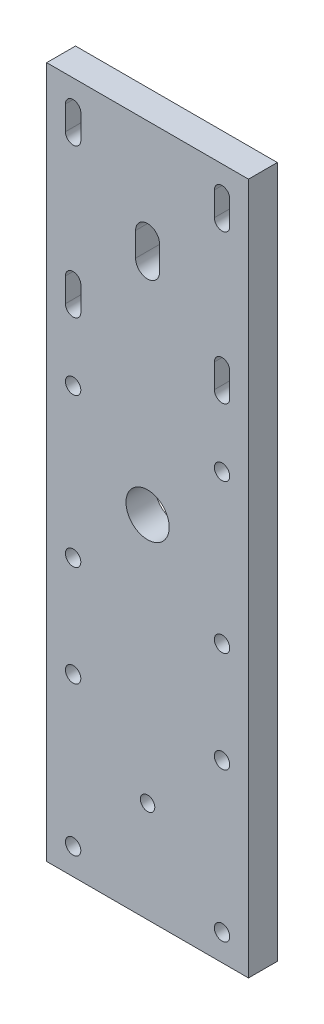
ISO-10303-21;
HEADER;
FILE_DESCRIPTION(('STEP AP214'),'2;1');
FILE_NAME('part.step','',(''),(''),'','','');
FILE_SCHEMA(('AUTOMOTIVE_DESIGN { 1 0 10303 214 1 1 1 1 }'));
ENDSEC;
DATA;
#1=APPLICATION_CONTEXT('core data for automotive mechanical design processes');
#2=APPLICATION_PROTOCOL_DEFINITION('international standard','automotive_design',2000,#1);
#3=PRODUCT_CONTEXT('',#1,'mechanical');
#4=PRODUCT('Part','Part','',(#3));
#5=PRODUCT_RELATED_PRODUCT_CATEGORY('part','',(#4));
#6=PRODUCT_DEFINITION_FORMATION('','',#4);
#7=PRODUCT_DEFINITION_CONTEXT('part definition',#1,'design');
#8=PRODUCT_DEFINITION('design','',#6,#7);
#9=PRODUCT_DEFINITION_SHAPE('','',#8);
#10=(LENGTH_UNIT() NAMED_UNIT(*) SI_UNIT(.MILLI.,.METRE.));
#11=(NAMED_UNIT(*) PLANE_ANGLE_UNIT() SI_UNIT($,.RADIAN.));
#12=(NAMED_UNIT(*) SI_UNIT($,.STERADIAN.) SOLID_ANGLE_UNIT());
#13=UNCERTAINTY_MEASURE_WITH_UNIT(LENGTH_MEASURE(1.E-05),#10,'distance_accuracy_value','');
#14=(GEOMETRIC_REPRESENTATION_CONTEXT(3) GLOBAL_UNCERTAINTY_ASSIGNED_CONTEXT((#13)) GLOBAL_UNIT_ASSIGNED_CONTEXT((#10,
#11,#12)) REPRESENTATION_CONTEXT('',''));
#15=CARTESIAN_POINT('',(0.,0.,0.));
#16=DIRECTION('',(0.,0.,1.));
#17=DIRECTION('',(1.,0.,0.));
#18=AXIS2_PLACEMENT_3D('',#15,#16,#17);
#19=CARTESIAN_POINT('',(15.5,86.4999999999999,6.));
#20=DIRECTION('',(0.,0.,-1.));
#21=DIRECTION('',(-1.,0.,0.));
#22=AXIS2_PLACEMENT_3D('',#19,#20,#21);
#23=CYLINDRICAL_SURFACE('',#22,1.6);
#24=CARTESIAN_POINT('',(15.5,86.4999999999999,0.));
#25=DIRECTION('',(0.,0.,1.));
#26=DIRECTION('',(1.,0.,0.));
#27=AXIS2_PLACEMENT_3D('',#24,#25,#26);
#28=CIRCLE('',#27,1.6);
#29=CARTESIAN_POINT('',(17.1000000000001,86.4999999999999,0.));
#30=VERTEX_POINT('',#29);
#31=CARTESIAN_POINT('',(13.9000000000001,86.4999999999999,0.));
#32=VERTEX_POINT('',#31);
#33=EDGE_CURVE('E323',#30,#32,#28,.T.);
#34=ORIENTED_EDGE('',*,*,#33,.F.);
#35=DIRECTION('',(0.,0.,-1.));
#36=VECTOR('',#35,1.);
#37=CARTESIAN_POINT('',(17.1000000000001,86.4999999999999,6.));
#38=LINE('',#37,#36);
#39=CARTESIAN_POINT('',(17.1000000000001,86.4999999999999,6.));
#40=VERTEX_POINT('',#39);
#41=EDGE_CURVE('E11',#40,#30,#38,.T.);
#42=ORIENTED_EDGE('',*,*,#41,.F.);
#43=CARTESIAN_POINT('',(15.5,86.4999999999999,6.));
#44=DIRECTION('',(0.,0.,1.));
#45=DIRECTION('',(1.,0.,0.));
#46=AXIS2_PLACEMENT_3D('',#43,#44,#45);
#47=CIRCLE('',#46,1.6);
#48=CARTESIAN_POINT('',(13.9000000000001,86.4999999999999,6.));
#49=VERTEX_POINT('',#48);
#50=EDGE_CURVE('E217',#40,#49,#47,.T.);
#51=ORIENTED_EDGE('',*,*,#50,.T.);
#52=DIRECTION('',(0.,0.,-1.));
#53=VECTOR('',#52,1.);
#54=CARTESIAN_POINT('',(13.9000000000001,86.4999999999999,6.));
#55=LINE('',#54,#53);
#56=EDGE_CURVE('E59',#49,#32,#55,.T.);
#57=ORIENTED_EDGE('',*,*,#56,.T.);
#58=EDGE_LOOP('',(#34,#42,#51,#57));
#59=FACE_BOUND('',#58,.T.);
#60=ADVANCED_FACE('F40',(#59),#23,.F.);
#61=CARTESIAN_POINT('',(17.1000000000001,0.,6.));
#62=DIRECTION('',(1.,0.,0.));
#63=DIRECTION('',(0.,0.,-1.));
#64=AXIS2_PLACEMENT_3D('',#61,#62,#63);
#65=PLANE('',#64);
#66=DIRECTION('',(0.,-1.,0.));
#67=VECTOR('',#66,1.);
#68=CARTESIAN_POINT('',(17.1000000000001,0.,0.));
#69=LINE('',#68,#67);
#70=CARTESIAN_POINT('',(17.1000000000001,81.5,0.));
#71=VERTEX_POINT('',#70);
#72=EDGE_CURVE('E223',#30,#71,#69,.T.);
#73=ORIENTED_EDGE('',*,*,#72,.T.);
#74=DIRECTION('',(0.,0.,-1.));
#75=VECTOR('',#74,1.);
#76=CARTESIAN_POINT('',(17.1000000000001,81.5,6.));
#77=LINE('',#76,#75);
#78=CARTESIAN_POINT('',(17.1000000000001,81.5,6.));
#79=VERTEX_POINT('',#78);
#80=EDGE_CURVE('E50',#79,#71,#77,.T.);
#81=ORIENTED_EDGE('',*,*,#80,.F.);
#82=DIRECTION('',(0.,-1.,0.));
#83=VECTOR('',#82,1.);
#84=CARTESIAN_POINT('',(17.1000000000001,0.,6.));
#85=LINE('',#84,#83);
#86=EDGE_CURVE('E210',#40,#79,#85,.T.);
#87=ORIENTED_EDGE('',*,*,#86,.F.);
#88=ORIENTED_EDGE('',*,*,#41,.T.);
#89=EDGE_LOOP('',(#73,#81,#87,#88));
#90=FACE_BOUND('',#89,.T.);
#91=ADVANCED_FACE('F221',(#90),#65,.F.);
#92=CARTESIAN_POINT('',(15.5,81.5,6.));
#93=DIRECTION('',(0.,0.,-1.));
#94=DIRECTION('',(-1.,0.,0.));
#95=AXIS2_PLACEMENT_3D('',#92,#93,#94);
#96=CYLINDRICAL_SURFACE('',#95,1.6);
#97=CARTESIAN_POINT('',(15.5,81.5,0.));
#98=DIRECTION('',(0.,0.,1.));
#99=DIRECTION('',(1.,0.,0.));
#100=AXIS2_PLACEMENT_3D('',#97,#98,#99);
#101=CIRCLE('',#100,1.6);
#102=CARTESIAN_POINT('',(13.9000000000001,81.5,0.));
#103=VERTEX_POINT('',#102);
#104=EDGE_CURVE('E326',#103,#71,#101,.T.);
#105=ORIENTED_EDGE('',*,*,#104,.F.);
#106=DIRECTION('',(0.,0.,-1.));
#107=VECTOR('',#106,1.);
#108=CARTESIAN_POINT('',(13.9000000000001,81.5,6.));
#109=LINE('',#108,#107);
#110=CARTESIAN_POINT('',(13.9000000000001,81.5,6.));
#111=VERTEX_POINT('',#110);
#112=EDGE_CURVE('E132',#111,#103,#109,.T.);
#113=ORIENTED_EDGE('',*,*,#112,.F.);
#114=CARTESIAN_POINT('',(15.5,81.5,6.));
#115=DIRECTION('',(0.,0.,1.));
#116=DIRECTION('',(1.,0.,0.));
#117=AXIS2_PLACEMENT_3D('',#114,#115,#116);
#118=CIRCLE('',#117,1.6);
#119=EDGE_CURVE('E216',#111,#79,#118,.T.);
#120=ORIENTED_EDGE('',*,*,#119,.T.);
#121=ORIENTED_EDGE('',*,*,#80,.T.);
#122=EDGE_LOOP('',(#105,#113,#120,#121));
#123=FACE_BOUND('',#122,.T.);
#124=ADVANCED_FACE('F227',(#123),#96,.F.);
#125=CARTESIAN_POINT('',(0.,66.,6.));
#126=DIRECTION('',(0.,0.,-1.));
#127=DIRECTION('',(-1.,0.,0.));
#128=AXIS2_PLACEMENT_3D('',#125,#126,#127);
#129=CYLINDRICAL_SURFACE('',#128,2.5);
#130=CARTESIAN_POINT('',(0.,66.,0.));
#131=DIRECTION('',(0.,0.,1.));
#132=DIRECTION('',(1.,0.,0.));
#133=AXIS2_PLACEMENT_3D('',#130,#131,#132);
#134=CIRCLE('',#133,2.5);
#135=CARTESIAN_POINT('',(-2.49999999999999,66.,0.));
#136=VERTEX_POINT('',#135);
#137=CARTESIAN_POINT('',(2.5,66.,0.));
#138=VERTEX_POINT('',#137);
#139=EDGE_CURVE('E311',#136,#138,#134,.T.);
#140=ORIENTED_EDGE('',*,*,#139,.F.);
#141=DIRECTION('',(0.,0.,-1.));
#142=VECTOR('',#141,1.);
#143=CARTESIAN_POINT('',(-2.49999999999999,66.,6.));
#144=LINE('',#143,#142);
#145=CARTESIAN_POINT('',(-2.49999999999999,66.,6.));
#146=VERTEX_POINT('',#145);
#147=EDGE_CURVE('E348',#146,#136,#144,.T.);
#148=ORIENTED_EDGE('',*,*,#147,.F.);
#149=CARTESIAN_POINT('',(0.,66.,6.));
#150=DIRECTION('',(0.,0.,1.));
#151=DIRECTION('',(1.,0.,0.));
#152=AXIS2_PLACEMENT_3D('',#149,#150,#151);
#153=CIRCLE('',#152,2.5);
#154=CARTESIAN_POINT('',(2.5,66.,6.));
#155=VERTEX_POINT('',#154);
#156=EDGE_CURVE('E459',#146,#155,#153,.T.);
#157=ORIENTED_EDGE('',*,*,#156,.T.);
#158=DIRECTION('',(0.,0.,-1.));
#159=VECTOR('',#158,1.);
#160=CARTESIAN_POINT('',(2.5,66.,6.));
#161=LINE('',#160,#159);
#162=EDGE_CURVE('E350',#155,#138,#161,.T.);
#163=ORIENTED_EDGE('',*,*,#162,.T.);
#164=EDGE_LOOP('',(#140,#148,#157,#163));
#165=FACE_BOUND('',#164,.T.);
#166=ADVANCED_FACE('F500',(#165),#129,.F.);
#167=CARTESIAN_POINT('',(-2.49999999999999,0.,6.));
#168=DIRECTION('',(1.,0.,0.));
#169=DIRECTION('',(0.,1.,0.));
#170=AXIS2_PLACEMENT_3D('',#167,#168,#169);
#171=PLANE('',#170);
#172=DIRECTION('',(0.,-1.,0.));
#173=VECTOR('',#172,1.);
#174=CARTESIAN_POINT('',(-2.49999999999999,0.,0.));
#175=LINE('',#174,#173);
#176=CARTESIAN_POINT('',(-2.5,70.9999999999999,0.));
#177=VERTEX_POINT('',#176);
#178=EDGE_CURVE('E314',#177,#136,#175,.T.);
#179=ORIENTED_EDGE('',*,*,#178,.F.);
#180=DIRECTION('',(0.,0.,-1.));
#181=VECTOR('',#180,1.);
#182=CARTESIAN_POINT('',(-2.5,70.9999999999999,6.));
#183=LINE('',#182,#181);
#184=CARTESIAN_POINT('',(-2.5,70.9999999999999,6.));
#185=VERTEX_POINT('',#184);
#186=EDGE_CURVE('E355',#185,#177,#183,.T.);
#187=ORIENTED_EDGE('',*,*,#186,.F.);
#188=DIRECTION('',(0.,-1.,0.));
#189=VECTOR('',#188,1.);
#190=CARTESIAN_POINT('',(-2.49999999999999,0.,6.));
#191=LINE('',#190,#189);
#192=EDGE_CURVE('E462',#185,#146,#191,.T.);
#193=ORIENTED_EDGE('',*,*,#192,.T.);
#194=ORIENTED_EDGE('',*,*,#147,.T.);
#195=EDGE_LOOP('',(#179,#187,#193,#194));
#196=FACE_BOUND('',#195,.T.);
#197=ADVANCED_FACE('F496',(#196),#171,.T.);
#198=CARTESIAN_POINT('',(0.,70.9999999999999,6.));
#199=DIRECTION('',(0.,0.,-1.));
#200=DIRECTION('',(-1.,0.,0.));
#201=AXIS2_PLACEMENT_3D('',#198,#199,#200);
#202=CYLINDRICAL_SURFACE('',#201,2.5);
#203=CARTESIAN_POINT('',(0.,70.9999999999999,0.));
#204=DIRECTION('',(0.,0.,1.));
#205=DIRECTION('',(1.,0.,0.));
#206=AXIS2_PLACEMENT_3D('',#203,#204,#205);
#207=CIRCLE('',#206,2.5);
#208=CARTESIAN_POINT('',(2.5,70.9999999999999,0.));
#209=VERTEX_POINT('',#208);
#210=EDGE_CURVE('E317',#209,#177,#207,.T.);
#211=ORIENTED_EDGE('',*,*,#210,.F.);
#212=DIRECTION('',(0.,0.,-1.));
#213=VECTOR('',#212,1.);
#214=CARTESIAN_POINT('',(2.5,70.9999999999999,6.));
#215=LINE('',#214,#213);
#216=CARTESIAN_POINT('',(2.5,70.9999999999999,6.));
#217=VERTEX_POINT('',#216);
#218=EDGE_CURVE('E352',#217,#209,#215,.T.);
#219=ORIENTED_EDGE('',*,*,#218,.F.);
#220=CARTESIAN_POINT('',(0.,70.9999999999999,6.));
#221=DIRECTION('',(0.,0.,1.));
#222=DIRECTION('',(1.,0.,0.));
#223=AXIS2_PLACEMENT_3D('',#220,#221,#222);
#224=CIRCLE('',#223,2.5);
#225=EDGE_CURVE('E465',#217,#185,#224,.T.);
#226=ORIENTED_EDGE('',*,*,#225,.T.);
#227=ORIENTED_EDGE('',*,*,#186,.T.);
#228=EDGE_LOOP('',(#211,#219,#226,#227));
#229=FACE_BOUND('',#228,.T.);
#230=ADVANCED_FACE('F492',(#229),#202,.F.);
#231=CARTESIAN_POINT('',(15.5,50.5000000000001,6.));
#232=DIRECTION('',(0.,0.,-1.));
#233=DIRECTION('',(-1.,0.,0.));
#234=AXIS2_PLACEMENT_3D('',#231,#232,#233);
#235=CYLINDRICAL_SURFACE('',#234,1.6);
#236=CARTESIAN_POINT('',(15.5,50.5000000000001,0.));
#237=DIRECTION('',(0.,0.,1.));
#238=DIRECTION('',(1.,0.,0.));
#239=AXIS2_PLACEMENT_3D('',#236,#237,#238);
#240=CIRCLE('',#239,1.6);
#241=CARTESIAN_POINT('',(13.9,50.5000000000001,0.));
#242=VERTEX_POINT('',#241);
#243=CARTESIAN_POINT('',(17.1,50.5000000000001,0.));
#244=VERTEX_POINT('',#243);
#245=EDGE_CURVE('E299',#242,#244,#240,.T.);
#246=ORIENTED_EDGE('',*,*,#245,.F.);
#247=DIRECTION('',(0.,0.,-1.));
#248=VECTOR('',#247,1.);
#249=CARTESIAN_POINT('',(13.9,50.5000000000001,6.));
#250=LINE('',#249,#248);
#251=CARTESIAN_POINT('',(13.9,50.5000000000001,6.));
#252=VERTEX_POINT('',#251);
#253=EDGE_CURVE('E353',#252,#242,#250,.T.);
#254=ORIENTED_EDGE('',*,*,#253,.F.);
#255=CARTESIAN_POINT('',(15.5,50.5000000000001,6.));
#256=DIRECTION('',(0.,0.,1.));
#257=DIRECTION('',(1.,0.,0.));
#258=AXIS2_PLACEMENT_3D('',#255,#256,#257);
#259=CIRCLE('',#258,1.6);
#260=CARTESIAN_POINT('',(17.1,50.5000000000001,6.));
#261=VERTEX_POINT('',#260);
#262=EDGE_CURVE('E448',#252,#261,#259,.T.);
#263=ORIENTED_EDGE('',*,*,#262,.T.);
#264=DIRECTION('',(0.,0.,-1.));
#265=VECTOR('',#264,1.);
#266=CARTESIAN_POINT('',(17.1,50.5000000000001,6.));
#267=LINE('',#266,#265);
#268=EDGE_CURVE('E358',#261,#244,#267,.T.);
#269=ORIENTED_EDGE('',*,*,#268,.T.);
#270=EDGE_LOOP('',(#246,#254,#263,#269));
#271=FACE_BOUND('',#270,.T.);
#272=ADVANCED_FACE('F495',(#271),#235,.F.);
#273=CARTESIAN_POINT('',(13.9,0.,6.));
#274=DIRECTION('',(1.,0.,0.));
#275=DIRECTION('',(0.,1.,0.));
#276=AXIS2_PLACEMENT_3D('',#273,#274,#275);
#277=PLANE('',#276);
#278=DIRECTION('',(0.,-1.,0.));
#279=VECTOR('',#278,1.);
#280=CARTESIAN_POINT('',(13.9,0.,0.));
#281=LINE('',#280,#279);
#282=CARTESIAN_POINT('',(13.9,55.5,0.));
#283=VERTEX_POINT('',#282);
#284=EDGE_CURVE('E302',#283,#242,#281,.T.);
#285=ORIENTED_EDGE('',*,*,#284,.F.);
#286=DIRECTION('',(0.,0.,-1.));
#287=VECTOR('',#286,1.);
#288=CARTESIAN_POINT('',(13.9,55.5,6.));
#289=LINE('',#288,#287);
#290=CARTESIAN_POINT('',(13.9,55.5,6.));
#291=VERTEX_POINT('',#290);
#292=EDGE_CURVE('E363',#291,#283,#289,.T.);
#293=ORIENTED_EDGE('',*,*,#292,.F.);
#294=DIRECTION('',(0.,-1.,0.));
#295=VECTOR('',#294,1.);
#296=CARTESIAN_POINT('',(13.9,0.,6.));
#297=LINE('',#296,#295);
#298=EDGE_CURVE('E451',#291,#252,#297,.T.);
#299=ORIENTED_EDGE('',*,*,#298,.T.);
#300=ORIENTED_EDGE('',*,*,#253,.T.);
#301=EDGE_LOOP('',(#285,#293,#299,#300));
#302=FACE_BOUND('',#301,.T.);
#303=ADVANCED_FACE('F513',(#302),#277,.T.);
#304=CARTESIAN_POINT('',(15.5,55.5,6.));
#305=DIRECTION('',(0.,0.,-1.));
#306=DIRECTION('',(-1.,0.,0.));
#307=AXIS2_PLACEMENT_3D('',#304,#305,#306);
#308=CYLINDRICAL_SURFACE('',#307,1.6);
#309=CARTESIAN_POINT('',(15.5,55.5,0.));
#310=DIRECTION('',(0.,0.,1.));
#311=DIRECTION('',(1.,0.,0.));
#312=AXIS2_PLACEMENT_3D('',#309,#310,#311);
#313=CIRCLE('',#312,1.6);
#314=CARTESIAN_POINT('',(17.1,55.5,0.));
#315=VERTEX_POINT('',#314);
#316=EDGE_CURVE('E305',#315,#283,#313,.T.);
#317=ORIENTED_EDGE('',*,*,#316,.F.);
#318=DIRECTION('',(0.,0.,-1.));
#319=VECTOR('',#318,1.);
#320=CARTESIAN_POINT('',(17.1,55.5,6.));
#321=LINE('',#320,#319);
#322=CARTESIAN_POINT('',(17.1,55.5,6.));
#323=VERTEX_POINT('',#322);
#324=EDGE_CURVE('E360',#323,#315,#321,.T.);
#325=ORIENTED_EDGE('',*,*,#324,.F.);
#326=CARTESIAN_POINT('',(15.5,55.5,6.));
#327=DIRECTION('',(0.,0.,1.));
#328=DIRECTION('',(1.,0.,0.));
#329=AXIS2_PLACEMENT_3D('',#326,#327,#328);
#330=CIRCLE('',#329,1.6);
#331=EDGE_CURVE('E454',#323,#291,#330,.T.);
#332=ORIENTED_EDGE('',*,*,#331,.T.);
#333=ORIENTED_EDGE('',*,*,#292,.T.);
#334=EDGE_LOOP('',(#317,#325,#332,#333));
#335=FACE_BOUND('',#334,.T.);
#336=ADVANCED_FACE('F509',(#335),#308,.F.);
#337=CARTESIAN_POINT('',(-15.4999999999999,81.5,6.));
#338=DIRECTION('',(0.,0.,-1.));
#339=DIRECTION('',(-1.,0.,0.));
#340=AXIS2_PLACEMENT_3D('',#337,#338,#339);
#341=CYLINDRICAL_SURFACE('',#340,1.60000000000001);
#342=CARTESIAN_POINT('',(-15.4999999999999,81.5,0.));
#343=DIRECTION('',(0.,0.,1.));
#344=DIRECTION('',(1.,0.,0.));
#345=AXIS2_PLACEMENT_3D('',#342,#343,#344);
#346=CIRCLE('',#345,1.60000000000001);
#347=CARTESIAN_POINT('',(-17.0999999999999,81.5,0.));
#348=VERTEX_POINT('',#347);
#349=CARTESIAN_POINT('',(-13.8999999999999,81.5,0.));
#350=VERTEX_POINT('',#349);
#351=EDGE_CURVE('E287',#348,#350,#346,.T.);
#352=ORIENTED_EDGE('',*,*,#351,.F.);
#353=DIRECTION('',(0.,0.,-1.));
#354=VECTOR('',#353,1.);
#355=CARTESIAN_POINT('',(-17.0999999999999,81.5,6.));
#356=LINE('',#355,#354);
#357=CARTESIAN_POINT('',(-17.0999999999999,81.5,6.));
#358=VERTEX_POINT('',#357);
#359=EDGE_CURVE('E361',#358,#348,#356,.T.);
#360=ORIENTED_EDGE('',*,*,#359,.F.);
#361=CARTESIAN_POINT('',(-15.4999999999999,81.5,6.));
#362=DIRECTION('',(0.,0.,1.));
#363=DIRECTION('',(1.,0.,0.));
#364=AXIS2_PLACEMENT_3D('',#361,#362,#363);
#365=CIRCLE('',#364,1.60000000000001);
#366=CARTESIAN_POINT('',(-13.8999999999999,81.5,6.));
#367=VERTEX_POINT('',#366);
#368=EDGE_CURVE('E437',#358,#367,#365,.T.);
#369=ORIENTED_EDGE('',*,*,#368,.T.);
#370=DIRECTION('',(0.,0.,-1.));
#371=VECTOR('',#370,1.);
#372=CARTESIAN_POINT('',(-13.8999999999999,81.5,6.));
#373=LINE('',#372,#371);
#374=EDGE_CURVE('E366',#367,#350,#373,.T.);
#375=ORIENTED_EDGE('',*,*,#374,.T.);
#376=EDGE_LOOP('',(#352,#360,#369,#375));
#377=FACE_BOUND('',#376,.T.);
#378=ADVANCED_FACE('F512',(#377),#341,.F.);
#379=CARTESIAN_POINT('',(-17.0999999999999,0.,6.));
#380=DIRECTION('',(1.,0.,0.));
#381=DIRECTION('',(0.,0.,-1.));
#382=AXIS2_PLACEMENT_3D('',#379,#380,#381);
#383=PLANE('',#382);
#384=DIRECTION('',(0.,-1.,0.));
#385=VECTOR('',#384,1.);
#386=CARTESIAN_POINT('',(-17.0999999999999,0.,0.));
#387=LINE('',#386,#385);
#388=CARTESIAN_POINT('',(-17.0999999999999,86.4999999999999,0.));
#389=VERTEX_POINT('',#388);
#390=EDGE_CURVE('E290',#389,#348,#387,.T.);
#391=ORIENTED_EDGE('',*,*,#390,.F.);
#392=DIRECTION('',(0.,0.,-1.));
#393=VECTOR('',#392,1.);
#394=CARTESIAN_POINT('',(-17.0999999999999,86.4999999999999,6.));
#395=LINE('',#394,#393);
#396=CARTESIAN_POINT('',(-17.0999999999999,86.4999999999999,6.));
#397=VERTEX_POINT('',#396);
#398=EDGE_CURVE('E371',#397,#389,#395,.T.);
#399=ORIENTED_EDGE('',*,*,#398,.F.);
#400=DIRECTION('',(0.,-1.,0.));
#401=VECTOR('',#400,1.);
#402=CARTESIAN_POINT('',(-17.0999999999999,0.,6.));
#403=LINE('',#402,#401);
#404=EDGE_CURVE('E440',#397,#358,#403,.T.);
#405=ORIENTED_EDGE('',*,*,#404,.T.);
#406=ORIENTED_EDGE('',*,*,#359,.T.);
#407=EDGE_LOOP('',(#391,#399,#405,#406));
#408=FACE_BOUND('',#407,.T.);
#409=ADVANCED_FACE('F529',(#408),#383,.T.);
#410=CARTESIAN_POINT('',(-15.4999999999999,86.5,6.));
#411=DIRECTION('',(0.,0.,-1.));
#412=DIRECTION('',(-1.,0.,0.));
#413=AXIS2_PLACEMENT_3D('',#410,#411,#412);
#414=CYLINDRICAL_SURFACE('',#413,1.60000000000001);
#415=CARTESIAN_POINT('',(-15.4999999999999,86.5,0.));
#416=DIRECTION('',(0.,0.,1.));
#417=DIRECTION('',(1.,0.,0.));
#418=AXIS2_PLACEMENT_3D('',#415,#416,#417);
#419=CIRCLE('',#418,1.60000000000001);
#420=CARTESIAN_POINT('',(-13.8999999999999,86.4999999999999,0.));
#421=VERTEX_POINT('',#420);
#422=EDGE_CURVE('E293',#421,#389,#419,.T.);
#423=ORIENTED_EDGE('',*,*,#422,.F.);
#424=DIRECTION('',(0.,0.,-1.));
#425=VECTOR('',#424,1.);
#426=CARTESIAN_POINT('',(-13.8999999999999,86.4999999999999,6.));
#427=LINE('',#426,#425);
#428=CARTESIAN_POINT('',(-13.8999999999999,86.4999999999999,6.));
#429=VERTEX_POINT('',#428);
#430=EDGE_CURVE('E368',#429,#421,#427,.T.);
#431=ORIENTED_EDGE('',*,*,#430,.F.);
#432=CARTESIAN_POINT('',(-15.4999999999999,86.5,6.));
#433=DIRECTION('',(0.,0.,1.));
#434=DIRECTION('',(1.,0.,0.));
#435=AXIS2_PLACEMENT_3D('',#432,#433,#434);
#436=CIRCLE('',#435,1.60000000000001);
#437=EDGE_CURVE('E443',#429,#397,#436,.T.);
#438=ORIENTED_EDGE('',*,*,#437,.T.);
#439=ORIENTED_EDGE('',*,*,#398,.T.);
#440=EDGE_LOOP('',(#423,#431,#438,#439));
#441=FACE_BOUND('',#440,.T.);
#442=ADVANCED_FACE('F525',(#441),#414,.F.);
#443=CARTESIAN_POINT('',(-15.4999999999999,50.5000000000001,6.));
#444=DIRECTION('',(0.,0.,-1.));
#445=DIRECTION('',(-1.,0.,0.));
#446=AXIS2_PLACEMENT_3D('',#443,#444,#445);
#447=CYLINDRICAL_SURFACE('',#446,1.6);
#448=CARTESIAN_POINT('',(-15.4999999999999,50.5000000000001,0.));
#449=DIRECTION('',(0.,0.,1.));
#450=DIRECTION('',(1.,0.,0.));
#451=AXIS2_PLACEMENT_3D('',#448,#449,#450);
#452=CIRCLE('',#451,1.6);
#453=CARTESIAN_POINT('',(-17.0999999999999,50.5000000000001,0.));
#454=VERTEX_POINT('',#453);
#455=CARTESIAN_POINT('',(-13.8999999999999,50.5000000000001,0.));
#456=VERTEX_POINT('',#455);
#457=EDGE_CURVE('E275',#454,#456,#452,.T.);
#458=ORIENTED_EDGE('',*,*,#457,.F.);
#459=DIRECTION('',(0.,0.,-1.));
#460=VECTOR('',#459,1.);
#461=CARTESIAN_POINT('',(-17.0999999999999,50.5000000000001,6.));
#462=LINE('',#461,#460);
#463=CARTESIAN_POINT('',(-17.0999999999999,50.5000000000001,6.));
#464=VERTEX_POINT('',#463);
#465=EDGE_CURVE('E369',#464,#454,#462,.T.);
#466=ORIENTED_EDGE('',*,*,#465,.F.);
#467=CARTESIAN_POINT('',(-15.4999999999999,50.5000000000001,6.));
#468=DIRECTION('',(0.,0.,1.));
#469=DIRECTION('',(1.,0.,0.));
#470=AXIS2_PLACEMENT_3D('',#467,#468,#469);
#471=CIRCLE('',#470,1.6);
#472=CARTESIAN_POINT('',(-13.8999999999999,50.5000000000001,6.));
#473=VERTEX_POINT('',#472);
#474=EDGE_CURVE('E426',#464,#473,#471,.T.);
#475=ORIENTED_EDGE('',*,*,#474,.T.);
#476=DIRECTION('',(0.,0.,-1.));
#477=VECTOR('',#476,1.);
#478=CARTESIAN_POINT('',(-13.8999999999999,50.5000000000001,6.));
#479=LINE('',#478,#477);
#480=EDGE_CURVE('E374',#473,#456,#479,.T.);
#481=ORIENTED_EDGE('',*,*,#480,.T.);
#482=EDGE_LOOP('',(#458,#466,#475,#481));
#483=FACE_BOUND('',#482,.T.);
#484=ADVANCED_FACE('F528',(#483),#447,.F.);
#485=CARTESIAN_POINT('',(-17.0999999999999,0.,6.));
#486=DIRECTION('',(1.,0.,0.));
#487=DIRECTION('',(0.,1.,0.));
#488=AXIS2_PLACEMENT_3D('',#485,#486,#487);
#489=PLANE('',#488);
#490=DIRECTION('',(0.,-1.,0.));
#491=VECTOR('',#490,1.);
#492=CARTESIAN_POINT('',(-17.0999999999999,0.,0.));
#493=LINE('',#492,#491);
#494=CARTESIAN_POINT('',(-17.0999999999999,55.5,0.));
#495=VERTEX_POINT('',#494);
#496=EDGE_CURVE('E278',#495,#454,#493,.T.);
#497=ORIENTED_EDGE('',*,*,#496,.F.);
#498=DIRECTION('',(0.,0.,-1.));
#499=VECTOR('',#498,1.);
#500=CARTESIAN_POINT('',(-17.0999999999999,55.5,6.));
#501=LINE('',#500,#499);
#502=CARTESIAN_POINT('',(-17.0999999999999,55.5,6.));
#503=VERTEX_POINT('',#502);
#504=EDGE_CURVE('E378',#503,#495,#501,.T.);
#505=ORIENTED_EDGE('',*,*,#504,.F.);
#506=DIRECTION('',(0.,-1.,0.));
#507=VECTOR('',#506,1.);
#508=CARTESIAN_POINT('',(-17.0999999999999,0.,6.));
#509=LINE('',#508,#507);
#510=EDGE_CURVE('E429',#503,#464,#509,.T.);
#511=ORIENTED_EDGE('',*,*,#510,.T.);
#512=ORIENTED_EDGE('',*,*,#465,.T.);
#513=EDGE_LOOP('',(#497,#505,#511,#512));
#514=FACE_BOUND('',#513,.T.);
#515=ADVANCED_FACE('F544',(#514),#489,.T.);
#516=CARTESIAN_POINT('',(-15.4999999999999,55.5,6.));
#517=DIRECTION('',(0.,0.,-1.));
#518=DIRECTION('',(-1.,0.,0.));
#519=AXIS2_PLACEMENT_3D('',#516,#517,#518);
#520=CYLINDRICAL_SURFACE('',#519,1.6);
#521=CARTESIAN_POINT('',(-15.4999999999999,55.5,0.));
#522=DIRECTION('',(0.,0.,1.));
#523=DIRECTION('',(1.,0.,0.));
#524=AXIS2_PLACEMENT_3D('',#521,#522,#523);
#525=CIRCLE('',#524,1.6);
#526=CARTESIAN_POINT('',(-13.8999999999999,55.5,0.));
#527=VERTEX_POINT('',#526);
#528=EDGE_CURVE('E281',#527,#495,#525,.T.);
#529=ORIENTED_EDGE('',*,*,#528,.F.);
#530=DIRECTION('',(0.,0.,-1.));
#531=VECTOR('',#530,1.);
#532=CARTESIAN_POINT('',(-13.8999999999999,55.5,6.));
#533=LINE('',#532,#531);
#534=CARTESIAN_POINT('',(-13.8999999999999,55.5,6.));
#535=VERTEX_POINT('',#534);
#536=EDGE_CURVE('E376',#535,#527,#533,.T.);
#537=ORIENTED_EDGE('',*,*,#536,.F.);
#538=CARTESIAN_POINT('',(-15.4999999999999,55.5,6.));
#539=DIRECTION('',(0.,0.,1.));
#540=DIRECTION('',(1.,0.,0.));
#541=AXIS2_PLACEMENT_3D('',#538,#539,#540);
#542=CIRCLE('',#541,1.6);
#543=EDGE_CURVE('E432',#535,#503,#542,.T.);
#544=ORIENTED_EDGE('',*,*,#543,.T.);
#545=ORIENTED_EDGE('',*,*,#504,.T.);
#546=EDGE_LOOP('',(#529,#537,#544,#545));
#547=FACE_BOUND('',#546,.T.);
#548=ADVANCED_FACE('F541',(#547),#520,.F.);
#549=CARTESIAN_POINT('',(0.,-52.,6.));
#550=DIRECTION('',(0.,1.,0.));
#551=DIRECTION('',(0.,0.,1.));
#552=AXIS2_PLACEMENT_3D('',#549,#550,#551);
#553=PLANE('',#552);
#554=DIRECTION('',(1.,0.,0.));
#555=VECTOR('',#554,1.);
#556=CARTESIAN_POINT('',(0.,-52.,0.));
#557=LINE('',#556,#555);
#558=CARTESIAN_POINT('',(-21.,-52.,0.));
#559=VERTEX_POINT('',#558);
#560=CARTESIAN_POINT('',(21.,-52.,0.));
#561=VERTEX_POINT('',#560);
#562=EDGE_CURVE('E252',#559,#561,#557,.T.);
#563=ORIENTED_EDGE('',*,*,#562,.T.);
#564=DIRECTION('',(0.,0.,-1.));
#565=VECTOR('',#564,1.);
#566=CARTESIAN_POINT('',(21.,-52.,6.));
#567=LINE('',#566,#565);
#568=CARTESIAN_POINT('',(21.,-52.,6.));
#569=VERTEX_POINT('',#568);
#570=EDGE_CURVE('E44',#569,#561,#567,.T.);
#571=ORIENTED_EDGE('',*,*,#570,.F.);
#572=DIRECTION('',(1.,0.,0.));
#573=VECTOR('',#572,1.);
#574=CARTESIAN_POINT('',(0.,-52.,6.));
#575=LINE('',#574,#573);
#576=CARTESIAN_POINT('',(-21.,-52.,6.));
#577=VERTEX_POINT('',#576);
#578=EDGE_CURVE('E145',#577,#569,#575,.T.);
#579=ORIENTED_EDGE('',*,*,#578,.F.);
#580=DIRECTION('',(0.,0.,-1.));
#581=VECTOR('',#580,1.);
#582=CARTESIAN_POINT('',(-21.,-52.,6.));
#583=LINE('',#582,#581);
#584=EDGE_CURVE('E248',#577,#559,#583,.T.);
#585=ORIENTED_EDGE('',*,*,#584,.T.);
#586=EDGE_LOOP('',(#563,#571,#579,#585));
#587=FACE_BOUND('',#586,.T.);
#588=ADVANCED_FACE('F395',(#587),#553,.F.);
#589=CARTESIAN_POINT('',(21.,0.,6.));
#590=DIRECTION('',(1.,0.,0.));
#591=DIRECTION('',(0.,1.,0.));
#592=AXIS2_PLACEMENT_3D('',#589,#590,#591);
#593=PLANE('',#592);
#594=DIRECTION('',(0.,-1.,0.));
#595=VECTOR('',#594,1.);
#596=CARTESIAN_POINT('',(21.,0.,0.));
#597=LINE('',#596,#595);
#598=CARTESIAN_POINT('',(21.,91.9999999999999,0.));
#599=VERTEX_POINT('',#598);
#600=EDGE_CURVE('E255',#599,#561,#597,.T.);
#601=ORIENTED_EDGE('',*,*,#600,.F.);
#602=DIRECTION('',(0.,0.,-1.));
#603=VECTOR('',#602,1.);
#604=CARTESIAN_POINT('',(21.,91.9999999999999,6.));
#605=LINE('',#604,#603);
#606=CARTESIAN_POINT('',(21.,91.9999999999999,6.));
#607=VERTEX_POINT('',#606);
#608=EDGE_CURVE('E384',#607,#599,#605,.T.);
#609=ORIENTED_EDGE('',*,*,#608,.F.);
#610=DIRECTION('',(0.,-1.,0.));
#611=VECTOR('',#610,1.);
#612=CARTESIAN_POINT('',(21.,0.,6.));
#613=LINE('',#612,#611);
#614=EDGE_CURVE('E392',#607,#569,#613,.T.);
#615=ORIENTED_EDGE('',*,*,#614,.T.);
#616=ORIENTED_EDGE('',*,*,#570,.T.);
#617=EDGE_LOOP('',(#601,#609,#615,#616));
#618=FACE_BOUND('',#617,.T.);
#619=ADVANCED_FACE('F391',(#618),#593,.T.);
#620=CARTESIAN_POINT('',(1.21595855077993E-13,92.,6.));
#621=DIRECTION('',(0.,1.,0.));
#622=DIRECTION('',(-1.,0.,0.));
#623=AXIS2_PLACEMENT_3D('',#620,#621,#622);
#624=PLANE('',#623);
#625=DIRECTION('',(1.,0.,0.));
#626=VECTOR('',#625,1.);
#627=CARTESIAN_POINT('',(1.21595855077993E-13,92.,0.));
#628=LINE('',#627,#626);
#629=CARTESIAN_POINT('',(-21.,92.,0.));
#630=VERTEX_POINT('',#629);
#631=EDGE_CURVE('E258',#630,#599,#628,.T.);
#632=ORIENTED_EDGE('',*,*,#631,.F.);
#633=DIRECTION('',(0.,0.,-1.));
#634=VECTOR('',#633,1.);
#635=CARTESIAN_POINT('',(-21.,92.,6.));
#636=LINE('',#635,#634);
#637=CARTESIAN_POINT('',(-21.,92.,6.));
#638=VERTEX_POINT('',#637);
#639=EDGE_CURVE('E383',#638,#630,#636,.T.);
#640=ORIENTED_EDGE('',*,*,#639,.F.);
#641=DIRECTION('',(1.,0.,0.));
#642=VECTOR('',#641,1.);
#643=CARTESIAN_POINT('',(1.21595855077993E-13,92.,6.));
#644=LINE('',#643,#642);
#645=EDGE_CURVE('E404',#638,#607,#644,.T.);
#646=ORIENTED_EDGE('',*,*,#645,.T.);
#647=ORIENTED_EDGE('',*,*,#608,.T.);
#648=EDGE_LOOP('',(#632,#640,#646,#647));
#649=FACE_BOUND('',#648,.T.);
#650=ADVANCED_FACE('F401',(#649),#624,.T.);
#651=CARTESIAN_POINT('',(-15.5,36.5,6.));
#652=DIRECTION('',(0.,0.,-1.));
#653=DIRECTION('',(-1.,0.,0.));
#654=AXIS2_PLACEMENT_3D('',#651,#652,#653);
#655=CYLINDRICAL_SURFACE('',#654,1.6);
#656=CARTESIAN_POINT('',(-15.5,36.5,6.));
#657=DIRECTION('',(0.,0.,1.));
#658=DIRECTION('',(1.,0.,0.));
#659=AXIS2_PLACEMENT_3D('',#656,#657,#658);
#660=CIRCLE('',#659,1.6);
#661=CARTESIAN_POINT('',(-13.9,36.5,6.));
#662=VERTEX_POINT('',#661);
#663=EDGE_CURVE('E242',#662,#662,#660,.T.);
#664=ORIENTED_EDGE('',*,*,#663,.T.);
#665=EDGE_LOOP('',(#664));
#666=FACE_BOUND('',#665,.T.);
#667=CARTESIAN_POINT('',(-15.5,36.5,0.));
#668=DIRECTION('',(0.,0.,1.));
#669=DIRECTION('',(1.,0.,0.));
#670=AXIS2_PLACEMENT_3D('',#667,#668,#669);
#671=CIRCLE('',#670,1.6);
#672=CARTESIAN_POINT('',(-13.9,36.5,0.));
#673=VERTEX_POINT('',#672);
#674=EDGE_CURVE('E340',#673,#673,#671,.T.);
#675=ORIENTED_EDGE('',*,*,#674,.F.);
#676=EDGE_LOOP('',(#675));
#677=FACE_BOUND('',#676,.T.);
#678=ADVANCED_FACE('F571',(#666,#677),#655,.F.);
#679=CARTESIAN_POINT('',(15.5,36.5,6.));
#680=DIRECTION('',(0.,0.,-1.));
#681=DIRECTION('',(-1.,0.,0.));
#682=AXIS2_PLACEMENT_3D('',#679,#680,#681);
#683=CYLINDRICAL_SURFACE('',#682,1.6);
#684=CARTESIAN_POINT('',(15.5,36.5,6.));
#685=DIRECTION('',(0.,0.,1.));
#686=DIRECTION('',(1.,0.,0.));
#687=AXIS2_PLACEMENT_3D('',#684,#685,#686);
#688=CIRCLE('',#687,1.6);
#689=CARTESIAN_POINT('',(17.1,36.5,6.));
#690=VERTEX_POINT('',#689);
#691=EDGE_CURVE('E239',#690,#690,#688,.T.);
#692=ORIENTED_EDGE('',*,*,#691,.T.);
#693=EDGE_LOOP('',(#692));
#694=FACE_BOUND('',#693,.T.);
#695=CARTESIAN_POINT('',(15.5,36.5,0.));
#696=DIRECTION('',(0.,0.,1.));
#697=DIRECTION('',(1.,0.,0.));
#698=AXIS2_PLACEMENT_3D('',#695,#696,#697);
#699=CIRCLE('',#698,1.6);
#700=CARTESIAN_POINT('',(17.1,36.5,0.));
#701=VERTEX_POINT('',#700);
#702=EDGE_CURVE('E337',#701,#701,#699,.T.);
#703=ORIENTED_EDGE('',*,*,#702,.F.);
#704=EDGE_LOOP('',(#703));
#705=FACE_BOUND('',#704,.T.);
#706=ADVANCED_FACE('F592',(#694,#705),#683,.F.);
#707=CARTESIAN_POINT('',(15.5,5.49999999999999,6.));
#708=DIRECTION('',(0.,0.,-1.));
#709=DIRECTION('',(-1.,0.,0.));
#710=AXIS2_PLACEMENT_3D('',#707,#708,#709);
#711=CYLINDRICAL_SURFACE('',#710,1.6);
#712=CARTESIAN_POINT('',(15.5,5.49999999999999,6.));
#713=DIRECTION('',(0.,0.,1.));
#714=DIRECTION('',(1.,0.,0.));
#715=AXIS2_PLACEMENT_3D('',#712,#713,#714);
#716=CIRCLE('',#715,1.6);
#717=CARTESIAN_POINT('',(17.1,5.49999999999999,6.));
#718=VERTEX_POINT('',#717);
#719=EDGE_CURVE('E236',#718,#718,#716,.T.);
#720=ORIENTED_EDGE('',*,*,#719,.T.);
#721=EDGE_LOOP('',(#720));
#722=FACE_BOUND('',#721,.T.);
#723=CARTESIAN_POINT('',(15.5,5.49999999999999,0.));
#724=DIRECTION('',(0.,0.,1.));
#725=DIRECTION('',(1.,0.,0.));
#726=AXIS2_PLACEMENT_3D('',#723,#724,#725);
#727=CIRCLE('',#726,1.6);
#728=CARTESIAN_POINT('',(17.1,5.49999999999999,0.));
#729=VERTEX_POINT('',#728);
#730=EDGE_CURVE('E334',#729,#729,#727,.T.);
#731=ORIENTED_EDGE('',*,*,#730,.F.);
#732=EDGE_LOOP('',(#731));
#733=FACE_BOUND('',#732,.T.);
#734=ADVANCED_FACE('F481',(#722,#733),#711,.F.);
#735=CARTESIAN_POINT('',(-15.5,5.49999999999999,6.));
#736=DIRECTION('',(0.,0.,-1.));
#737=DIRECTION('',(-1.,0.,0.));
#738=AXIS2_PLACEMENT_3D('',#735,#736,#737);
#739=CYLINDRICAL_SURFACE('',#738,1.6);
#740=CARTESIAN_POINT('',(-15.5,5.49999999999999,6.));
#741=DIRECTION('',(0.,0.,1.));
#742=DIRECTION('',(1.,0.,0.));
#743=AXIS2_PLACEMENT_3D('',#740,#741,#742);
#744=CIRCLE('',#743,1.6);
#745=CARTESIAN_POINT('',(-13.9,5.49999999999999,6.));
#746=VERTEX_POINT('',#745);
#747=EDGE_CURVE('E230',#746,#746,#744,.T.);
#748=ORIENTED_EDGE('',*,*,#747,.T.);
#749=EDGE_LOOP('',(#748));
#750=FACE_BOUND('',#749,.T.);
#751=CARTESIAN_POINT('',(-15.5,5.49999999999999,0.));
#752=DIRECTION('',(0.,0.,1.));
#753=DIRECTION('',(1.,0.,0.));
#754=AXIS2_PLACEMENT_3D('',#751,#752,#753);
#755=CIRCLE('',#754,1.6);
#756=CARTESIAN_POINT('',(-13.9,5.49999999999999,0.));
#757=VERTEX_POINT('',#756);
#758=EDGE_CURVE('E331',#757,#757,#755,.T.);
#759=ORIENTED_EDGE('',*,*,#758,.F.);
#760=EDGE_LOOP('',(#759));
#761=FACE_BOUND('',#760,.T.);
#762=ADVANCED_FACE('F472',(#750,#761),#739,.F.);
#763=CARTESIAN_POINT('',(13.9000000000001,0.,6.));
#764=DIRECTION('',(1.,0.,0.));
#765=DIRECTION('',(0.,1.,0.));
#766=AXIS2_PLACEMENT_3D('',#763,#764,#765);
#767=PLANE('',#766);
#768=DIRECTION('',(0.,-1.,0.));
#769=VECTOR('',#768,1.);
#770=CARTESIAN_POINT('',(13.9000000000001,0.,0.));
#771=LINE('',#770,#769);
#772=EDGE_CURVE('E328',#32,#103,#771,.T.);
#773=ORIENTED_EDGE('',*,*,#772,.F.);
#774=ORIENTED_EDGE('',*,*,#56,.F.);
#775=DIRECTION('',(0.,-1.,0.));
#776=VECTOR('',#775,1.);
#777=CARTESIAN_POINT('',(13.9000000000001,0.,6.));
#778=LINE('',#777,#776);
#779=EDGE_CURVE('E228',#49,#111,#778,.T.);
#780=ORIENTED_EDGE('',*,*,#779,.T.);
#781=ORIENTED_EDGE('',*,*,#112,.T.);
#782=EDGE_LOOP('',(#773,#774,#780,#781));
#783=FACE_BOUND('',#782,.T.);
#784=ADVANCED_FACE('F469',(#783),#767,.T.);
#785=CARTESIAN_POINT('',(2.5,0.,6.));
#786=DIRECTION('',(1.,0.,0.));
#787=DIRECTION('',(0.,1.,0.));
#788=AXIS2_PLACEMENT_3D('',#785,#786,#787);
#789=PLANE('',#788);
#790=DIRECTION('',(0.,-1.,0.));
#791=VECTOR('',#790,1.);
#792=CARTESIAN_POINT('',(2.5,0.,0.));
#793=LINE('',#792,#791);
#794=EDGE_CURVE('E320',#209,#138,#793,.T.);
#795=ORIENTED_EDGE('',*,*,#794,.T.);
#796=ORIENTED_EDGE('',*,*,#162,.F.);
#797=DIRECTION('',(0.,-1.,0.));
#798=VECTOR('',#797,1.);
#799=CARTESIAN_POINT('',(2.5,0.,6.));
#800=LINE('',#799,#798);
#801=EDGE_CURVE('E468',#217,#155,#800,.T.);
#802=ORIENTED_EDGE('',*,*,#801,.F.);
#803=ORIENTED_EDGE('',*,*,#218,.T.);
#804=EDGE_LOOP('',(#795,#796,#802,#803));
#805=FACE_BOUND('',#804,.T.);
#806=ADVANCED_FACE('F471',(#805),#789,.F.);
#807=CARTESIAN_POINT('',(17.1,0.,6.));
#808=DIRECTION('',(1.,0.,0.));
#809=DIRECTION('',(0.,0.,-1.));
#810=AXIS2_PLACEMENT_3D('',#807,#808,#809);
#811=PLANE('',#810);
#812=DIRECTION('',(0.,-1.,0.));
#813=VECTOR('',#812,1.);
#814=CARTESIAN_POINT('',(17.1,0.,0.));
#815=LINE('',#814,#813);
#816=EDGE_CURVE('E308',#315,#244,#815,.T.);
#817=ORIENTED_EDGE('',*,*,#816,.T.);
#818=ORIENTED_EDGE('',*,*,#268,.F.);
#819=DIRECTION('',(0.,-1.,0.));
#820=VECTOR('',#819,1.);
#821=CARTESIAN_POINT('',(17.1,0.,6.));
#822=LINE('',#821,#820);
#823=EDGE_CURVE('E457',#323,#261,#822,.T.);
#824=ORIENTED_EDGE('',*,*,#823,.F.);
#825=ORIENTED_EDGE('',*,*,#324,.T.);
#826=EDGE_LOOP('',(#817,#818,#824,#825));
#827=FACE_BOUND('',#826,.T.);
#828=ADVANCED_FACE('F478',(#827),#811,.F.);
#829=CARTESIAN_POINT('',(-13.8999999999999,0.,6.));
#830=DIRECTION('',(1.,0.,0.));
#831=DIRECTION('',(0.,0.,-1.));
#832=AXIS2_PLACEMENT_3D('',#829,#830,#831);
#833=PLANE('',#832);
#834=DIRECTION('',(0.,-1.,0.));
#835=VECTOR('',#834,1.);
#836=CARTESIAN_POINT('',(-13.8999999999999,0.,0.));
#837=LINE('',#836,#835);
#838=EDGE_CURVE('E296',#421,#350,#837,.T.);
#839=ORIENTED_EDGE('',*,*,#838,.T.);
#840=ORIENTED_EDGE('',*,*,#374,.F.);
#841=DIRECTION('',(0.,-1.,0.));
#842=VECTOR('',#841,1.);
#843=CARTESIAN_POINT('',(-13.8999999999999,0.,6.));
#844=LINE('',#843,#842);
#845=EDGE_CURVE('E446',#429,#367,#844,.T.);
#846=ORIENTED_EDGE('',*,*,#845,.F.);
#847=ORIENTED_EDGE('',*,*,#430,.T.);
#848=EDGE_LOOP('',(#839,#840,#846,#847));
#849=FACE_BOUND('',#848,.T.);
#850=ADVANCED_FACE('F507',(#849),#833,.F.);
#851=CARTESIAN_POINT('',(-13.8999999999999,0.,6.));
#852=DIRECTION('',(1.,0.,0.));
#853=DIRECTION('',(0.,0.,-1.));
#854=AXIS2_PLACEMENT_3D('',#851,#852,#853);
#855=PLANE('',#854);
#856=DIRECTION('',(0.,-1.,0.));
#857=VECTOR('',#856,1.);
#858=CARTESIAN_POINT('',(-13.8999999999999,0.,0.));
#859=LINE('',#858,#857);
#860=EDGE_CURVE('E284',#527,#456,#859,.T.);
#861=ORIENTED_EDGE('',*,*,#860,.T.);
#862=ORIENTED_EDGE('',*,*,#480,.F.);
#863=DIRECTION('',(0.,-1.,0.));
#864=VECTOR('',#863,1.);
#865=CARTESIAN_POINT('',(-13.8999999999999,0.,6.));
#866=LINE('',#865,#864);
#867=EDGE_CURVE('E435',#535,#473,#866,.T.);
#868=ORIENTED_EDGE('',*,*,#867,.F.);
#869=ORIENTED_EDGE('',*,*,#536,.T.);
#870=EDGE_LOOP('',(#861,#862,#868,#869));
#871=FACE_BOUND('',#870,.T.);
#872=ADVANCED_FACE('F523',(#871),#855,.F.);
#873=CARTESIAN_POINT('',(15.5,-15.5,6.));
#874=DIRECTION('',(0.,0.,-1.));
#875=DIRECTION('',(-1.,0.,0.));
#876=AXIS2_PLACEMENT_3D('',#873,#874,#875);
#877=CYLINDRICAL_SURFACE('',#876,1.6);
#878=CARTESIAN_POINT('',(15.5,-15.5,6.));
#879=DIRECTION('',(0.,0.,1.));
#880=DIRECTION('',(1.,0.,0.));
#881=AXIS2_PLACEMENT_3D('',#878,#879,#880);
#882=CIRCLE('',#881,1.6);
#883=CARTESIAN_POINT('',(17.1,-15.5,6.));
#884=VERTEX_POINT('',#883);
#885=EDGE_CURVE('E423',#884,#884,#882,.T.);
#886=ORIENTED_EDGE('',*,*,#885,.T.);
#887=EDGE_LOOP('',(#886));
#888=FACE_BOUND('',#887,.T.);
#889=CARTESIAN_POINT('',(15.5,-15.5,0.));
#890=DIRECTION('',(0.,0.,1.));
#891=DIRECTION('',(1.,0.,0.));
#892=AXIS2_PLACEMENT_3D('',#889,#890,#891);
#893=CIRCLE('',#892,1.6);
#894=CARTESIAN_POINT('',(17.1,-15.5,0.));
#895=VERTEX_POINT('',#894);
#896=EDGE_CURVE('E272',#895,#895,#893,.T.);
#897=ORIENTED_EDGE('',*,*,#896,.F.);
#898=EDGE_LOOP('',(#897));
#899=FACE_BOUND('',#898,.T.);
#900=ADVANCED_FACE('F539',(#888,#899),#877,.F.);
#901=CARTESIAN_POINT('',(-15.5,-15.5,6.));
#902=DIRECTION('',(0.,0.,-1.));
#903=DIRECTION('',(-1.,0.,0.));
#904=AXIS2_PLACEMENT_3D('',#901,#902,#903);
#905=CYLINDRICAL_SURFACE('',#904,1.6);
#906=CARTESIAN_POINT('',(-15.5,-15.5,6.));
#907=DIRECTION('',(0.,0.,1.));
#908=DIRECTION('',(1.,0.,0.));
#909=AXIS2_PLACEMENT_3D('',#906,#907,#908);
#910=CIRCLE('',#909,1.6);
#911=CARTESIAN_POINT('',(-13.9,-15.5,6.));
#912=VERTEX_POINT('',#911);
#913=EDGE_CURVE('E420',#912,#912,#910,.T.);
#914=ORIENTED_EDGE('',*,*,#913,.T.);
#915=EDGE_LOOP('',(#914));
#916=FACE_BOUND('',#915,.T.);
#917=CARTESIAN_POINT('',(-15.5,-15.5,0.));
#918=DIRECTION('',(0.,0.,1.));
#919=DIRECTION('',(1.,0.,0.));
#920=AXIS2_PLACEMENT_3D('',#917,#918,#919);
#921=CIRCLE('',#920,1.6);
#922=CARTESIAN_POINT('',(-13.9,-15.5,0.));
#923=VERTEX_POINT('',#922);
#924=EDGE_CURVE('E269',#923,#923,#921,.T.);
#925=ORIENTED_EDGE('',*,*,#924,.F.);
#926=EDGE_LOOP('',(#925));
#927=FACE_BOUND('',#926,.T.);
#928=ADVANCED_FACE('F554',(#916,#927),#905,.F.);
#929=CARTESIAN_POINT('',(-15.5,-46.5,6.));
#930=DIRECTION('',(0.,0.,-1.));
#931=DIRECTION('',(-1.,0.,0.));
#932=AXIS2_PLACEMENT_3D('',#929,#930,#931);
#933=CYLINDRICAL_SURFACE('',#932,1.6);
#934=CARTESIAN_POINT('',(-15.5,-46.5,6.));
#935=DIRECTION('',(0.,0.,1.));
#936=DIRECTION('',(1.,0.,0.));
#937=AXIS2_PLACEMENT_3D('',#934,#935,#936);
#938=CIRCLE('',#937,1.6);
#939=CARTESIAN_POINT('',(-13.9,-46.5,6.));
#940=VERTEX_POINT('',#939);
#941=EDGE_CURVE('E417',#940,#940,#938,.T.);
#942=ORIENTED_EDGE('',*,*,#941,.T.);
#943=EDGE_LOOP('',(#942));
#944=FACE_BOUND('',#943,.T.);
#945=CARTESIAN_POINT('',(-15.5,-46.5,0.));
#946=DIRECTION('',(0.,0.,1.));
#947=DIRECTION('',(1.,0.,0.));
#948=AXIS2_PLACEMENT_3D('',#945,#946,#947);
#949=CIRCLE('',#948,1.6);
#950=CARTESIAN_POINT('',(-13.9,-46.5,0.));
#951=VERTEX_POINT('',#950);
#952=EDGE_CURVE('E266',#951,#951,#949,.T.);
#953=ORIENTED_EDGE('',*,*,#952,.F.);
#954=EDGE_LOOP('',(#953));
#955=FACE_BOUND('',#954,.T.);
#956=ADVANCED_FACE('F558',(#944,#955),#933,.F.);
#957=CARTESIAN_POINT('',(0.,-31.,6.));
#958=DIRECTION('',(0.,0.,-1.));
#959=DIRECTION('',(-1.,0.,0.));
#960=AXIS2_PLACEMENT_3D('',#957,#958,#959);
#961=CYLINDRICAL_SURFACE('',#960,1.5);
#962=CARTESIAN_POINT('',(0.,-31.,6.));
#963=DIRECTION('',(0.,0.,1.));
#964=DIRECTION('',(1.,0.,0.));
#965=AXIS2_PLACEMENT_3D('',#962,#963,#964);
#966=CIRCLE('',#965,1.5);
#967=CARTESIAN_POINT('',(1.5,-31.,6.));
#968=VERTEX_POINT('',#967);
#969=EDGE_CURVE('E408',#968,#968,#966,.T.);
#970=ORIENTED_EDGE('',*,*,#969,.T.);
#971=EDGE_LOOP('',(#970));
#972=FACE_BOUND('',#971,.T.);
#973=CARTESIAN_POINT('',(0.,-31.,0.));
#974=DIRECTION('',(0.,0.,1.));
#975=DIRECTION('',(1.,0.,0.));
#976=AXIS2_PLACEMENT_3D('',#973,#974,#975);
#977=CIRCLE('',#976,1.5);
#978=CARTESIAN_POINT('',(1.5,-31.,0.));
#979=VERTEX_POINT('',#978);
#980=EDGE_CURVE('E263',#979,#979,#977,.T.);
#981=ORIENTED_EDGE('',*,*,#980,.F.);
#982=EDGE_LOOP('',(#981));
#983=FACE_BOUND('',#982,.T.);
#984=ADVANCED_FACE('F562',(#972,#983),#961,.F.);
#985=CARTESIAN_POINT('',(-21.0000000000001,0.,6.));
#986=DIRECTION('',(1.,0.,0.));
#987=DIRECTION('',(0.,1.,0.));
#988=AXIS2_PLACEMENT_3D('',#985,#986,#987);
#989=PLANE('',#988);
#990=DIRECTION('',(0.,-1.,0.));
#991=VECTOR('',#990,1.);
#992=CARTESIAN_POINT('',(-21.0000000000001,0.,0.));
#993=LINE('',#992,#991);
#994=EDGE_CURVE('E261',#630,#559,#993,.T.);
#995=ORIENTED_EDGE('',*,*,#994,.T.);
#996=ORIENTED_EDGE('',*,*,#584,.F.);
#997=DIRECTION('',(0.,-1.,0.));
#998=VECTOR('',#997,1.);
#999=CARTESIAN_POINT('',(-21.0000000000001,0.,6.));
#1000=LINE('',#999,#998);
#1001=EDGE_CURVE('E406',#638,#577,#1000,.T.);
#1002=ORIENTED_EDGE('',*,*,#1001,.F.);
#1003=ORIENTED_EDGE('',*,*,#639,.T.);
#1004=EDGE_LOOP('',(#995,#996,#1002,#1003));
#1005=FACE_BOUND('',#1004,.T.);
#1006=ADVANCED_FACE('F407',(#1005),#989,.F.);
#1007=CARTESIAN_POINT('',(15.5,-46.5,6.));
#1008=DIRECTION('',(0.,0.,-1.));
#1009=DIRECTION('',(-1.,0.,0.));
#1010=AXIS2_PLACEMENT_3D('',#1007,#1008,#1009);
#1011=CYLINDRICAL_SURFACE('',#1010,1.6);
#1012=CARTESIAN_POINT('',(15.5,-46.5,6.));
#1013=DIRECTION('',(0.,0.,1.));
#1014=DIRECTION('',(1.,0.,0.));
#1015=AXIS2_PLACEMENT_3D('',#1012,#1013,#1014);
#1016=CIRCLE('',#1015,1.6);
#1017=CARTESIAN_POINT('',(17.1,-46.5,6.));
#1018=VERTEX_POINT('',#1017);
#1019=EDGE_CURVE('E346',#1018,#1018,#1016,.T.);
#1020=ORIENTED_EDGE('',*,*,#1019,.T.);
#1021=EDGE_LOOP('',(#1020));
#1022=FACE_BOUND('',#1021,.T.);
#1023=CARTESIAN_POINT('',(15.5,-46.5,0.));
#1024=DIRECTION('',(0.,0.,1.));
#1025=DIRECTION('',(1.,0.,0.));
#1026=AXIS2_PLACEMENT_3D('',#1023,#1024,#1025);
#1027=CIRCLE('',#1026,1.6);
#1028=CARTESIAN_POINT('',(17.1,-46.5,0.));
#1029=VERTEX_POINT('',#1028);
#1030=EDGE_CURVE('E249',#1029,#1029,#1027,.T.);
#1031=ORIENTED_EDGE('',*,*,#1030,.F.);
#1032=EDGE_LOOP('',(#1031));
#1033=FACE_BOUND('',#1032,.T.);
#1034=ADVANCED_FACE('F42',(#1022,#1033),#1011,.F.);
#1035=CARTESIAN_POINT('',(0.,21.,6.));
#1036=DIRECTION('',(0.,0.,-1.));
#1037=DIRECTION('',(-1.,0.,0.));
#1038=AXIS2_PLACEMENT_3D('',#1035,#1036,#1037);
#1039=CYLINDRICAL_SURFACE('',#1038,4.5);
#1040=CARTESIAN_POINT('',(0.,21.,6.));
#1041=DIRECTION('',(0.,0.,1.));
#1042=DIRECTION('',(1.,0.,0.));
#1043=AXIS2_PLACEMENT_3D('',#1040,#1041,#1042);
#1044=CIRCLE('',#1043,4.5);
#1045=CARTESIAN_POINT('',(4.5,21.,6.));
#1046=VERTEX_POINT('',#1045);
#1047=EDGE_CURVE('E245',#1046,#1046,#1044,.T.);
#1048=ORIENTED_EDGE('',*,*,#1047,.T.);
#1049=EDGE_LOOP('',(#1048));
#1050=FACE_BOUND('',#1049,.T.);
#1051=CARTESIAN_POINT('',(0.,21.,0.));
#1052=DIRECTION('',(0.,0.,1.));
#1053=DIRECTION('',(1.,0.,0.));
#1054=AXIS2_PLACEMENT_3D('',#1051,#1052,#1053);
#1055=CIRCLE('',#1054,4.5);
#1056=CARTESIAN_POINT('',(4.5,21.,0.));
#1057=VERTEX_POINT('',#1056);
#1058=EDGE_CURVE('E343',#1057,#1057,#1055,.T.);
#1059=ORIENTED_EDGE('',*,*,#1058,.F.);
#1060=EDGE_LOOP('',(#1059));
#1061=FACE_BOUND('',#1060,.T.);
#1062=ADVANCED_FACE('F681',(#1050,#1061),#1039,.F.);
#1063=CARTESIAN_POINT('',(0.,0.,6.));
#1064=DIRECTION('',(0.,0.,1.));
#1065=DIRECTION('',(1.,0.,0.));
#1066=AXIS2_PLACEMENT_3D('',#1063,#1064,#1065);
#1067=PLANE('',#1066);
#1068=ORIENTED_EDGE('',*,*,#1019,.F.);
#1069=EDGE_LOOP('',(#1068));
#1070=FACE_BOUND('',#1069,.T.);
#1071=ORIENTED_EDGE('',*,*,#578,.T.);
#1072=ORIENTED_EDGE('',*,*,#614,.F.);
#1073=ORIENTED_EDGE('',*,*,#645,.F.);
#1074=ORIENTED_EDGE('',*,*,#1001,.T.);
#1075=EDGE_LOOP('',(#1071,#1072,#1073,#1074));
#1076=FACE_BOUND('',#1075,.T.);
#1077=ORIENTED_EDGE('',*,*,#969,.F.);
#1078=EDGE_LOOP('',(#1077));
#1079=FACE_BOUND('',#1078,.T.);
#1080=ORIENTED_EDGE('',*,*,#941,.F.);
#1081=EDGE_LOOP('',(#1080));
#1082=FACE_BOUND('',#1081,.T.);
#1083=ORIENTED_EDGE('',*,*,#913,.F.);
#1084=EDGE_LOOP('',(#1083));
#1085=FACE_BOUND('',#1084,.T.);
#1086=ORIENTED_EDGE('',*,*,#885,.F.);
#1087=EDGE_LOOP('',(#1086));
#1088=FACE_BOUND('',#1087,.T.);
#1089=ORIENTED_EDGE('',*,*,#474,.F.);
#1090=ORIENTED_EDGE('',*,*,#510,.F.);
#1091=ORIENTED_EDGE('',*,*,#543,.F.);
#1092=ORIENTED_EDGE('',*,*,#867,.T.);
#1093=EDGE_LOOP('',(#1089,#1090,#1091,#1092));
#1094=FACE_BOUND('',#1093,.T.);
#1095=ORIENTED_EDGE('',*,*,#368,.F.);
#1096=ORIENTED_EDGE('',*,*,#404,.F.);
#1097=ORIENTED_EDGE('',*,*,#437,.F.);
#1098=ORIENTED_EDGE('',*,*,#845,.T.);
#1099=EDGE_LOOP('',(#1095,#1096,#1097,#1098));
#1100=FACE_BOUND('',#1099,.T.);
#1101=ORIENTED_EDGE('',*,*,#262,.F.);
#1102=ORIENTED_EDGE('',*,*,#298,.F.);
#1103=ORIENTED_EDGE('',*,*,#331,.F.);
#1104=ORIENTED_EDGE('',*,*,#823,.T.);
#1105=EDGE_LOOP('',(#1101,#1102,#1103,#1104));
#1106=FACE_BOUND('',#1105,.T.);
#1107=ORIENTED_EDGE('',*,*,#156,.F.);
#1108=ORIENTED_EDGE('',*,*,#192,.F.);
#1109=ORIENTED_EDGE('',*,*,#225,.F.);
#1110=ORIENTED_EDGE('',*,*,#801,.T.);
#1111=EDGE_LOOP('',(#1107,#1108,#1109,#1110));
#1112=FACE_BOUND('',#1111,.T.);
#1113=ORIENTED_EDGE('',*,*,#50,.F.);
#1114=ORIENTED_EDGE('',*,*,#86,.T.);
#1115=ORIENTED_EDGE('',*,*,#119,.F.);
#1116=ORIENTED_EDGE('',*,*,#779,.F.);
#1117=EDGE_LOOP('',(#1113,#1114,#1115,#1116));
#1118=FACE_BOUND('',#1117,.T.);
#1119=ORIENTED_EDGE('',*,*,#747,.F.);
#1120=EDGE_LOOP('',(#1119));
#1121=FACE_BOUND('',#1120,.T.);
#1122=ORIENTED_EDGE('',*,*,#719,.F.);
#1123=EDGE_LOOP('',(#1122));
#1124=FACE_BOUND('',#1123,.T.);
#1125=ORIENTED_EDGE('',*,*,#691,.F.);
#1126=EDGE_LOOP('',(#1125));
#1127=FACE_BOUND('',#1126,.T.);
#1128=ORIENTED_EDGE('',*,*,#663,.F.);
#1129=EDGE_LOOP('',(#1128));
#1130=FACE_BOUND('',#1129,.T.);
#1131=ORIENTED_EDGE('',*,*,#1047,.F.);
#1132=EDGE_LOOP('',(#1131));
#1133=FACE_BOUND('',#1132,.T.);
#1134=ADVANCED_FACE('F212',(#1070,#1076,#1079,#1082,#1085,#1088,#1094,#1100,#1106,#1112,#1118,
#1121,#1124,#1127,#1130,#1133),#1067,.T.);
#1135=CARTESIAN_POINT('',(0.,0.,0.));
#1136=DIRECTION('',(0.,0.,1.));
#1137=DIRECTION('',(1.,0.,0.));
#1138=AXIS2_PLACEMENT_3D('',#1135,#1136,#1137);
#1139=PLANE('',#1138);
#1140=ORIENTED_EDGE('',*,*,#1030,.T.);
#1141=EDGE_LOOP('',(#1140));
#1142=FACE_BOUND('',#1141,.T.);
#1143=ORIENTED_EDGE('',*,*,#562,.F.);
#1144=ORIENTED_EDGE('',*,*,#994,.F.);
#1145=ORIENTED_EDGE('',*,*,#631,.T.);
#1146=ORIENTED_EDGE('',*,*,#600,.T.);
#1147=EDGE_LOOP('',(#1143,#1144,#1145,#1146));
#1148=FACE_BOUND('',#1147,.T.);
#1149=ORIENTED_EDGE('',*,*,#980,.T.);
#1150=EDGE_LOOP('',(#1149));
#1151=FACE_BOUND('',#1150,.T.);
#1152=ORIENTED_EDGE('',*,*,#952,.T.);
#1153=EDGE_LOOP('',(#1152));
#1154=FACE_BOUND('',#1153,.T.);
#1155=ORIENTED_EDGE('',*,*,#924,.T.);
#1156=EDGE_LOOP('',(#1155));
#1157=FACE_BOUND('',#1156,.T.);
#1158=ORIENTED_EDGE('',*,*,#896,.T.);
#1159=EDGE_LOOP('',(#1158));
#1160=FACE_BOUND('',#1159,.T.);
#1161=ORIENTED_EDGE('',*,*,#457,.T.);
#1162=ORIENTED_EDGE('',*,*,#860,.F.);
#1163=ORIENTED_EDGE('',*,*,#528,.T.);
#1164=ORIENTED_EDGE('',*,*,#496,.T.);
#1165=EDGE_LOOP('',(#1161,#1162,#1163,#1164));
#1166=FACE_BOUND('',#1165,.T.);
#1167=ORIENTED_EDGE('',*,*,#351,.T.);
#1168=ORIENTED_EDGE('',*,*,#838,.F.);
#1169=ORIENTED_EDGE('',*,*,#422,.T.);
#1170=ORIENTED_EDGE('',*,*,#390,.T.);
#1171=EDGE_LOOP('',(#1167,#1168,#1169,#1170));
#1172=FACE_BOUND('',#1171,.T.);
#1173=ORIENTED_EDGE('',*,*,#245,.T.);
#1174=ORIENTED_EDGE('',*,*,#816,.F.);
#1175=ORIENTED_EDGE('',*,*,#316,.T.);
#1176=ORIENTED_EDGE('',*,*,#284,.T.);
#1177=EDGE_LOOP('',(#1173,#1174,#1175,#1176));
#1178=FACE_BOUND('',#1177,.T.);
#1179=ORIENTED_EDGE('',*,*,#139,.T.);
#1180=ORIENTED_EDGE('',*,*,#794,.F.);
#1181=ORIENTED_EDGE('',*,*,#210,.T.);
#1182=ORIENTED_EDGE('',*,*,#178,.T.);
#1183=EDGE_LOOP('',(#1179,#1180,#1181,#1182));
#1184=FACE_BOUND('',#1183,.T.);
#1185=ORIENTED_EDGE('',*,*,#33,.T.);
#1186=ORIENTED_EDGE('',*,*,#772,.T.);
#1187=ORIENTED_EDGE('',*,*,#104,.T.);
#1188=ORIENTED_EDGE('',*,*,#72,.F.);
#1189=EDGE_LOOP('',(#1185,#1186,#1187,#1188));
#1190=FACE_BOUND('',#1189,.T.);
#1191=ORIENTED_EDGE('',*,*,#758,.T.);
#1192=EDGE_LOOP('',(#1191));
#1193=FACE_BOUND('',#1192,.T.);
#1194=ORIENTED_EDGE('',*,*,#730,.T.);
#1195=EDGE_LOOP('',(#1194));
#1196=FACE_BOUND('',#1195,.T.);
#1197=ORIENTED_EDGE('',*,*,#702,.T.);
#1198=EDGE_LOOP('',(#1197));
#1199=FACE_BOUND('',#1198,.T.);
#1200=ORIENTED_EDGE('',*,*,#674,.T.);
#1201=EDGE_LOOP('',(#1200));
#1202=FACE_BOUND('',#1201,.T.);
#1203=ORIENTED_EDGE('',*,*,#1058,.T.);
#1204=EDGE_LOOP('',(#1203));
#1205=FACE_BOUND('',#1204,.T.);
#1206=ADVANCED_FACE('F399',(#1142,#1148,#1151,#1154,#1157,#1160,#1166,#1172,#1178,#1184,#1190,
#1193,#1196,#1199,#1202,#1205),#1139,.F.);
#1207=CLOSED_SHELL('',(#60,#91,#124,#166,#197,#230,#272,#303,#336,#378,#409,#442,#484,#515,#548,
#588,#619,#650,#678,#706,#734,#762,#784,#806,#828,#850,#872,#900,#928,#956,#984,#1006,#1034,
#1062,#1134,#1206));
#1208=MANIFOLD_SOLID_BREP('B2',#1207);
#1209=ADVANCED_BREP_SHAPE_REPRESENTATION('',(#18,#1208),#14);
#1210=SHAPE_DEFINITION_REPRESENTATION(#9,#1209);
ENDSEC;
END-ISO-10303-21;
